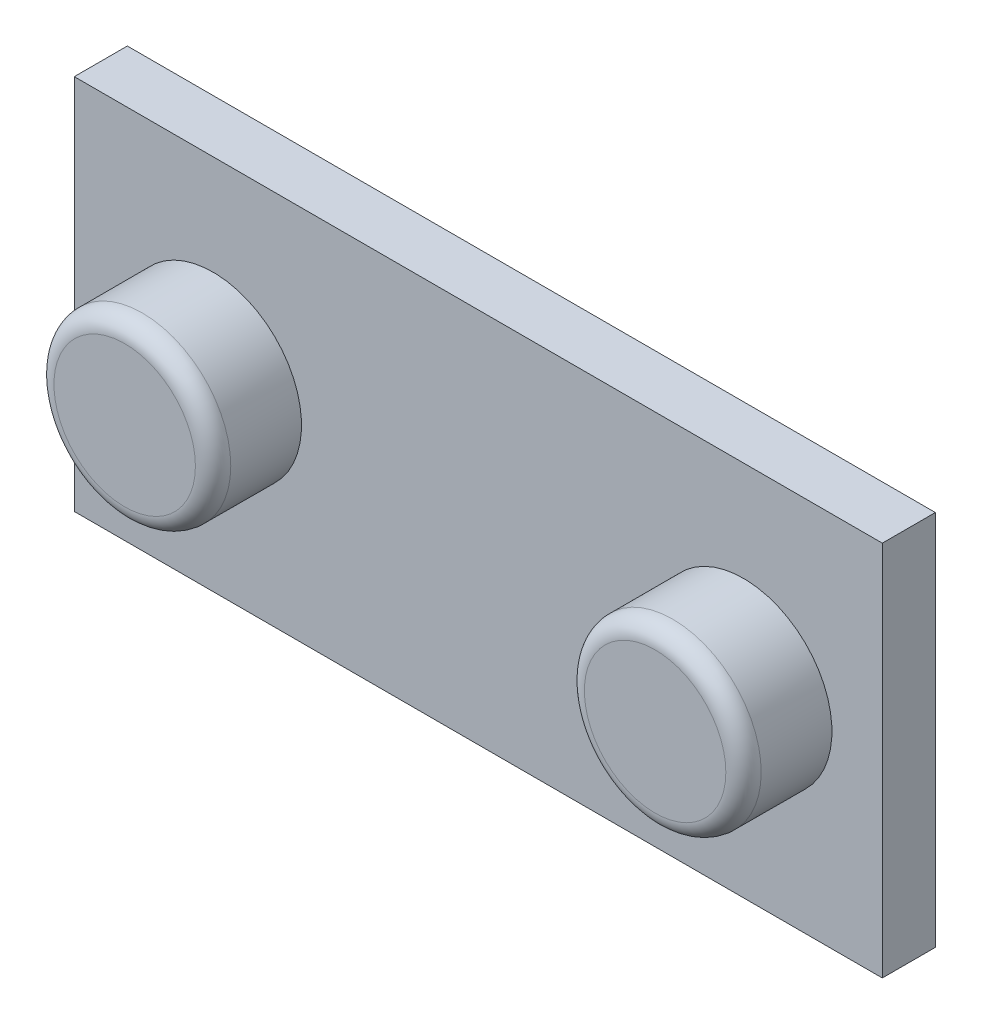
ISO-10303-21;
HEADER;
FILE_DESCRIPTION(('STEP AP214'),'2;1');
FILE_NAME('part.step','',(''),(''),'','','');
FILE_SCHEMA(('AUTOMOTIVE_DESIGN { 1 0 10303 214 1 1 1 1 }'));
ENDSEC;
DATA;
#1=APPLICATION_CONTEXT('core data for automotive mechanical design processes');
#2=APPLICATION_PROTOCOL_DEFINITION('international standard','automotive_design',2000,#1);
#3=PRODUCT_CONTEXT('',#1,'mechanical');
#4=PRODUCT('Part','Part','',(#3));
#5=PRODUCT_RELATED_PRODUCT_CATEGORY('part','',(#4));
#6=PRODUCT_DEFINITION_FORMATION('','',#4);
#7=PRODUCT_DEFINITION_CONTEXT('part definition',#1,'design');
#8=PRODUCT_DEFINITION('design','',#6,#7);
#9=PRODUCT_DEFINITION_SHAPE('','',#8);
#10=(LENGTH_UNIT() NAMED_UNIT(*) SI_UNIT(.MILLI.,.METRE.));
#11=(NAMED_UNIT(*) PLANE_ANGLE_UNIT() SI_UNIT($,.RADIAN.));
#12=(NAMED_UNIT(*) SI_UNIT($,.STERADIAN.) SOLID_ANGLE_UNIT());
#13=UNCERTAINTY_MEASURE_WITH_UNIT(LENGTH_MEASURE(1.E-05),#10,'distance_accuracy_value','');
#14=(GEOMETRIC_REPRESENTATION_CONTEXT(3) GLOBAL_UNCERTAINTY_ASSIGNED_CONTEXT((#13)) GLOBAL_UNIT_ASSIGNED_CONTEXT((#10,
#11,#12)) REPRESENTATION_CONTEXT('',''));
#15=CARTESIAN_POINT('',(0.,0.,0.));
#16=DIRECTION('',(0.,0.,1.));
#17=DIRECTION('',(1.,0.,0.));
#18=AXIS2_PLACEMENT_3D('',#15,#16,#17);
#19=CARTESIAN_POINT('',(22.85,-10.65,3.));
#20=DIRECTION('',(-1.,0.,0.));
#21=DIRECTION('',(0.,0.,1.));
#22=AXIS2_PLACEMENT_3D('',#19,#20,#21);
#23=PLANE('',#22);
#24=DIRECTION('',(0.,1.,0.));
#25=VECTOR('',#24,1.);
#26=CARTESIAN_POINT('',(22.85,-10.65,0.));
#27=LINE('',#26,#25);
#28=CARTESIAN_POINT('',(22.85,-10.65,0.));
#29=VERTEX_POINT('',#28);
#30=CARTESIAN_POINT('',(22.85,10.65,0.));
#31=VERTEX_POINT('',#30);
#32=EDGE_CURVE('E104',#29,#31,#27,.T.);
#33=ORIENTED_EDGE('',*,*,#32,.T.);
#34=DIRECTION('',(0.,0.,-1.));
#35=VECTOR('',#34,1.);
#36=CARTESIAN_POINT('',(22.85,10.65,3.));
#37=LINE('',#36,#35);
#38=CARTESIAN_POINT('',(22.85,10.65,3.));
#39=VERTEX_POINT('',#38);
#40=EDGE_CURVE('E95',#39,#31,#37,.T.);
#41=ORIENTED_EDGE('',*,*,#40,.F.);
#42=DIRECTION('',(0.,1.,0.));
#43=VECTOR('',#42,1.);
#44=CARTESIAN_POINT('',(22.85,-10.65,3.));
#45=LINE('',#44,#43);
#46=CARTESIAN_POINT('',(22.85,-10.65,3.));
#47=VERTEX_POINT('',#46);
#48=EDGE_CURVE('E89',#47,#39,#45,.T.);
#49=ORIENTED_EDGE('',*,*,#48,.F.);
#50=DIRECTION('',(0.,0.,-1.));
#51=VECTOR('',#50,1.);
#52=CARTESIAN_POINT('',(22.85,-10.65,3.));
#53=LINE('',#52,#51);
#54=EDGE_CURVE('E100',#47,#29,#53,.T.);
#55=ORIENTED_EDGE('',*,*,#54,.T.);
#56=EDGE_LOOP('',(#33,#41,#49,#55));
#57=FACE_BOUND('',#56,.T.);
#58=ADVANCED_FACE('F36',(#57),#23,.F.);
#59=CARTESIAN_POINT('',(-22.85,10.65,3.));
#60=DIRECTION('',(0.,-1.,0.));
#61=DIRECTION('',(0.,0.,-1.));
#62=AXIS2_PLACEMENT_3D('',#59,#60,#61);
#63=PLANE('',#62);
#64=DIRECTION('',(-1.,0.,0.));
#65=VECTOR('',#64,1.);
#66=CARTESIAN_POINT('',(-22.85,10.65,0.));
#67=LINE('',#66,#65);
#68=CARTESIAN_POINT('',(-22.85,10.65,0.));
#69=VERTEX_POINT('',#68);
#70=EDGE_CURVE('E94',#31,#69,#67,.T.);
#71=ORIENTED_EDGE('',*,*,#70,.T.);
#72=DIRECTION('',(0.,0.,-1.));
#73=VECTOR('',#72,1.);
#74=CARTESIAN_POINT('',(-22.85,10.65,3.));
#75=LINE('',#74,#73);
#76=CARTESIAN_POINT('',(-22.85,10.65,3.));
#77=VERTEX_POINT('',#76);
#78=EDGE_CURVE('E92',#77,#69,#75,.T.);
#79=ORIENTED_EDGE('',*,*,#78,.F.);
#80=DIRECTION('',(-1.,0.,0.));
#81=VECTOR('',#80,1.);
#82=CARTESIAN_POINT('',(-22.85,10.65,3.));
#83=LINE('',#82,#81);
#84=EDGE_CURVE('E84',#39,#77,#83,.T.);
#85=ORIENTED_EDGE('',*,*,#84,.F.);
#86=ORIENTED_EDGE('',*,*,#40,.T.);
#87=EDGE_LOOP('',(#71,#79,#85,#86));
#88=FACE_BOUND('',#87,.T.);
#89=ADVANCED_FACE('F93',(#88),#63,.F.);
#90=CARTESIAN_POINT('',(-22.85,-10.65,3.));
#91=DIRECTION('',(1.,0.,0.));
#92=DIRECTION('',(0.,0.,-1.));
#93=AXIS2_PLACEMENT_3D('',#90,#91,#92);
#94=PLANE('',#93);
#95=DIRECTION('',(0.,-1.,0.));
#96=VECTOR('',#95,1.);
#97=CARTESIAN_POINT('',(-22.85,-10.65,0.));
#98=LINE('',#97,#96);
#99=CARTESIAN_POINT('',(-22.85,-10.65,0.));
#100=VERTEX_POINT('',#99);
#101=EDGE_CURVE('E70',#69,#100,#98,.T.);
#102=ORIENTED_EDGE('',*,*,#101,.T.);
#103=DIRECTION('',(0.,0.,-1.));
#104=VECTOR('',#103,1.);
#105=CARTESIAN_POINT('',(-22.85,-10.65,3.));
#106=LINE('',#105,#104);
#107=CARTESIAN_POINT('',(-22.85,-10.65,3.));
#108=VERTEX_POINT('',#107);
#109=EDGE_CURVE('E96',#108,#100,#106,.T.);
#110=ORIENTED_EDGE('',*,*,#109,.F.);
#111=DIRECTION('',(0.,-1.,0.));
#112=VECTOR('',#111,1.);
#113=CARTESIAN_POINT('',(-22.85,-10.65,3.));
#114=LINE('',#113,#112);
#115=EDGE_CURVE('E87',#77,#108,#114,.T.);
#116=ORIENTED_EDGE('',*,*,#115,.F.);
#117=ORIENTED_EDGE('',*,*,#78,.T.);
#118=EDGE_LOOP('',(#102,#110,#116,#117));
#119=FACE_BOUND('',#118,.T.);
#120=ADVANCED_FACE('F98',(#119),#94,.F.);
#121=CARTESIAN_POINT('',(-22.85,-10.65,3.));
#122=DIRECTION('',(0.,1.,0.));
#123=DIRECTION('',(0.,0.,1.));
#124=AXIS2_PLACEMENT_3D('',#121,#122,#123);
#125=PLANE('',#124);
#126=DIRECTION('',(1.,0.,0.));
#127=VECTOR('',#126,1.);
#128=CARTESIAN_POINT('',(-22.85,-10.65,0.));
#129=LINE('',#128,#127);
#130=EDGE_CURVE('E76',#100,#29,#129,.T.);
#131=ORIENTED_EDGE('',*,*,#130,.T.);
#132=ORIENTED_EDGE('',*,*,#54,.F.);
#133=DIRECTION('',(1.,0.,0.));
#134=VECTOR('',#133,1.);
#135=CARTESIAN_POINT('',(-22.85,-10.65,3.));
#136=LINE('',#135,#134);
#137=EDGE_CURVE('E53',#108,#47,#136,.T.);
#138=ORIENTED_EDGE('',*,*,#137,.F.);
#139=ORIENTED_EDGE('',*,*,#109,.T.);
#140=EDGE_LOOP('',(#131,#132,#138,#139));
#141=FACE_BOUND('',#140,.T.);
#142=ADVANCED_FACE('F147',(#141),#125,.F.);
#143=CARTESIAN_POINT('',(0.,0.,3.));
#144=DIRECTION('',(0.,0.,-1.));
#145=DIRECTION('',(-1.,0.,0.));
#146=AXIS2_PLACEMENT_3D('',#143,#144,#145);
#147=PLANE('',#146);
#148=CARTESIAN_POINT('',(15.,0.,3.));
#149=DIRECTION('',(0.,0.,-1.));
#150=DIRECTION('',(-1.,0.,0.));
#151=AXIS2_PLACEMENT_3D('',#148,#149,#150);
#152=CIRCLE('',#151,5.);
#153=CARTESIAN_POINT('',(10.,0.,3.));
#154=VERTEX_POINT('',#153);
#155=EDGE_CURVE('E116',#154,#154,#152,.F.);
#156=ORIENTED_EDGE('',*,*,#155,.F.);
#157=EDGE_LOOP('',(#156));
#158=FACE_BOUND('',#157,.T.);
#159=CARTESIAN_POINT('',(-15.,0.,3.));
#160=DIRECTION('',(0.,0.,-1.));
#161=DIRECTION('',(-1.,0.,0.));
#162=AXIS2_PLACEMENT_3D('',#159,#160,#161);
#163=CIRCLE('',#162,5.);
#164=CARTESIAN_POINT('',(-20.,0.,3.));
#165=VERTEX_POINT('',#164);
#166=EDGE_CURVE('E113',#165,#165,#163,.F.);
#167=ORIENTED_EDGE('',*,*,#166,.F.);
#168=EDGE_LOOP('',(#167));
#169=FACE_BOUND('',#168,.T.);
#170=ORIENTED_EDGE('',*,*,#48,.T.);
#171=ORIENTED_EDGE('',*,*,#84,.T.);
#172=ORIENTED_EDGE('',*,*,#115,.T.);
#173=ORIENTED_EDGE('',*,*,#137,.T.);
#174=EDGE_LOOP('',(#170,#171,#172,#173));
#175=FACE_BOUND('',#174,.T.);
#176=ADVANCED_FACE('F85',(#158,#169,#175),#147,.F.);
#177=CARTESIAN_POINT('',(0.,0.,0.));
#178=DIRECTION('',(0.,0.,-1.));
#179=DIRECTION('',(-1.,0.,0.));
#180=AXIS2_PLACEMENT_3D('',#177,#178,#179);
#181=PLANE('',#180);
#182=ORIENTED_EDGE('',*,*,#32,.F.);
#183=ORIENTED_EDGE('',*,*,#130,.F.);
#184=ORIENTED_EDGE('',*,*,#101,.F.);
#185=ORIENTED_EDGE('',*,*,#70,.F.);
#186=EDGE_LOOP('',(#182,#183,#184,#185));
#187=FACE_BOUND('',#186,.T.);
#188=ADVANCED_FACE('F150',(#187),#181,.T.);
#189=CARTESIAN_POINT('',(-15.,0.,8.));
#190=DIRECTION('',(0.,0.,-1.));
#191=DIRECTION('',(-1.,0.,0.));
#192=AXIS2_PLACEMENT_3D('',#189,#190,#191);
#193=CYLINDRICAL_SURFACE('',#192,5.);
#194=CARTESIAN_POINT('',(-15.,0.,7.));
#195=DIRECTION('',(0.,0.,1.));
#196=DIRECTION('',(1.,0.,0.));
#197=AXIS2_PLACEMENT_3D('',#194,#195,#196);
#198=CIRCLE('',#197,5.);
#199=CARTESIAN_POINT('',(-10.,0.,7.));
#200=VERTEX_POINT('',#199);
#201=EDGE_CURVE('E122',#200,#200,#198,.F.);
#202=ORIENTED_EDGE('',*,*,#201,.T.);
#203=EDGE_LOOP('',(#202));
#204=FACE_BOUND('',#203,.T.);
#205=ORIENTED_EDGE('',*,*,#166,.T.);
#206=EDGE_LOOP('',(#205));
#207=FACE_BOUND('',#206,.T.);
#208=ADVANCED_FACE('F153',(#204,#207),#193,.T.);
#209=CARTESIAN_POINT('',(-15.,0.,8.));
#210=DIRECTION('',(0.,0.,1.));
#211=DIRECTION('',(1.,0.,0.));
#212=AXIS2_PLACEMENT_3D('',#209,#210,#211);
#213=PLANE('',#212);
#214=CARTESIAN_POINT('',(-15.,0.,8.));
#215=DIRECTION('',(0.,0.,1.));
#216=DIRECTION('',(1.,0.,0.));
#217=AXIS2_PLACEMENT_3D('',#214,#215,#216);
#218=CIRCLE('',#217,4.);
#219=CARTESIAN_POINT('',(-11.,0.,8.));
#220=VERTEX_POINT('',#219);
#221=EDGE_CURVE('E119',#220,#220,#218,.T.);
#222=ORIENTED_EDGE('',*,*,#221,.T.);
#223=EDGE_LOOP('',(#222));
#224=FACE_BOUND('',#223,.T.);
#225=ADVANCED_FACE('F160',(#224),#213,.T.);
#226=CARTESIAN_POINT('',(15.,0.,8.));
#227=DIRECTION('',(0.,0.,-1.));
#228=DIRECTION('',(-1.,0.,0.));
#229=AXIS2_PLACEMENT_3D('',#226,#227,#228);
#230=CYLINDRICAL_SURFACE('',#229,5.);
#231=CARTESIAN_POINT('',(15.,0.,7.));
#232=DIRECTION('',(0.,0.,1.));
#233=DIRECTION('',(1.,0.,0.));
#234=AXIS2_PLACEMENT_3D('',#231,#232,#233);
#235=CIRCLE('',#234,5.);
#236=CARTESIAN_POINT('',(20.,0.,7.));
#237=VERTEX_POINT('',#236);
#238=EDGE_CURVE('E11',#237,#237,#235,.F.);
#239=ORIENTED_EDGE('',*,*,#238,.T.);
#240=EDGE_LOOP('',(#239));
#241=FACE_BOUND('',#240,.T.);
#242=ORIENTED_EDGE('',*,*,#155,.T.);
#243=EDGE_LOOP('',(#242));
#244=FACE_BOUND('',#243,.T.);
#245=ADVANCED_FACE('F164',(#241,#244),#230,.T.);
#246=CARTESIAN_POINT('',(15.,0.,8.));
#247=DIRECTION('',(0.,0.,1.));
#248=DIRECTION('',(1.,0.,0.));
#249=AXIS2_PLACEMENT_3D('',#246,#247,#248);
#250=PLANE('',#249);
#251=CARTESIAN_POINT('',(15.,0.,8.));
#252=DIRECTION('',(0.,0.,1.));
#253=DIRECTION('',(1.,0.,0.));
#254=AXIS2_PLACEMENT_3D('',#251,#252,#253);
#255=CIRCLE('',#254,4.);
#256=CARTESIAN_POINT('',(19.,0.,8.));
#257=VERTEX_POINT('',#256);
#258=EDGE_CURVE('E45',#257,#257,#255,.T.);
#259=ORIENTED_EDGE('',*,*,#258,.T.);
#260=EDGE_LOOP('',(#259));
#261=FACE_BOUND('',#260,.T.);
#262=ADVANCED_FACE('F127',(#261),#250,.T.);
#263=CARTESIAN_POINT('',(-15.,0.,7.));
#264=DIRECTION('',(0.,0.,1.));
#265=DIRECTION('',(1.,0.,0.));
#266=AXIS2_PLACEMENT_3D('',#263,#264,#265);
#267=TOROIDAL_SURFACE('',#266,4.,1.);
#268=ORIENTED_EDGE('',*,*,#201,.F.);
#269=EDGE_LOOP('',(#268));
#270=FACE_BOUND('',#269,.T.);
#271=ORIENTED_EDGE('',*,*,#221,.F.);
#272=EDGE_LOOP('',(#271));
#273=FACE_BOUND('',#272,.T.);
#274=ADVANCED_FACE('F130',(#270,#273),#267,.T.);
#275=CARTESIAN_POINT('',(15.,0.,7.));
#276=DIRECTION('',(0.,0.,1.));
#277=DIRECTION('',(1.,0.,0.));
#278=AXIS2_PLACEMENT_3D('',#275,#276,#277);
#279=TOROIDAL_SURFACE('',#278,4.,1.);
#280=ORIENTED_EDGE('',*,*,#238,.F.);
#281=EDGE_LOOP('',(#280));
#282=FACE_BOUND('',#281,.T.);
#283=ORIENTED_EDGE('',*,*,#258,.F.);
#284=EDGE_LOOP('',(#283));
#285=FACE_BOUND('',#284,.T.);
#286=ADVANCED_FACE('F38',(#282,#285),#279,.T.);
#287=CLOSED_SHELL('',(#58,#89,#120,#142,#176,#188,#208,#225,#245,#262,#274,#286));
#288=MANIFOLD_SOLID_BREP('B2',#287);
#289=ADVANCED_BREP_SHAPE_REPRESENTATION('',(#18,#288),#14);
#290=SHAPE_DEFINITION_REPRESENTATION(#9,#289);
ENDSEC;
END-ISO-10303-21;
